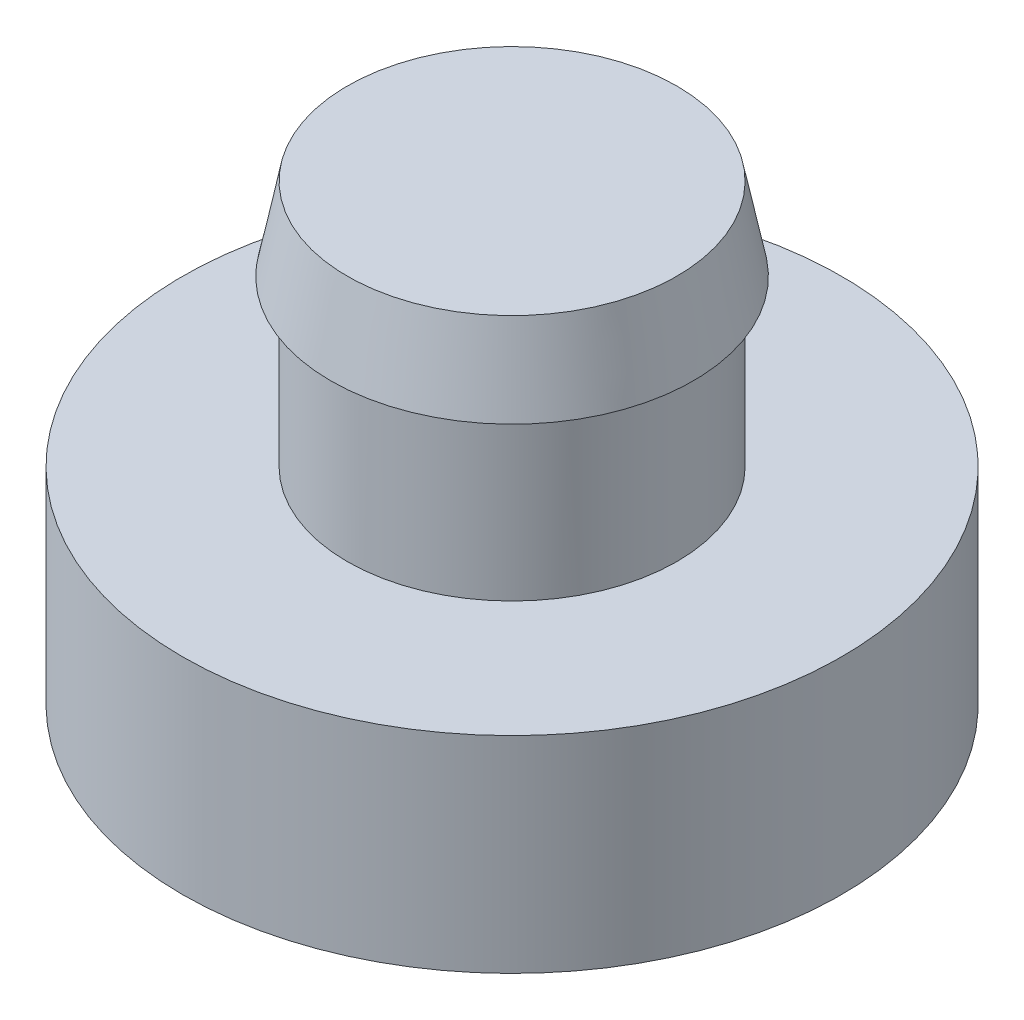
ISO-10303-21;
HEADER;
FILE_DESCRIPTION(('STEP AP214'),'2;1');
FILE_NAME('part.step','',(''),(''),'','','');
FILE_SCHEMA(('AUTOMOTIVE_DESIGN { 1 0 10303 214 1 1 1 1 }'));
ENDSEC;
DATA;
#1=APPLICATION_CONTEXT('core data for automotive mechanical design processes');
#2=APPLICATION_PROTOCOL_DEFINITION('international standard','automotive_design',2000,#1);
#3=PRODUCT_CONTEXT('',#1,'mechanical');
#4=PRODUCT('Part','Part','',(#3));
#5=PRODUCT_RELATED_PRODUCT_CATEGORY('part','',(#4));
#6=PRODUCT_DEFINITION_FORMATION('','',#4);
#7=PRODUCT_DEFINITION_CONTEXT('part definition',#1,'design');
#8=PRODUCT_DEFINITION('design','',#6,#7);
#9=PRODUCT_DEFINITION_SHAPE('','',#8);
#10=(LENGTH_UNIT() NAMED_UNIT(*) SI_UNIT(.MILLI.,.METRE.));
#11=(NAMED_UNIT(*) PLANE_ANGLE_UNIT() SI_UNIT($,.RADIAN.));
#12=(NAMED_UNIT(*) SI_UNIT($,.STERADIAN.) SOLID_ANGLE_UNIT());
#13=UNCERTAINTY_MEASURE_WITH_UNIT(LENGTH_MEASURE(1.E-05),#10,'distance_accuracy_value','');
#14=(GEOMETRIC_REPRESENTATION_CONTEXT(3) GLOBAL_UNCERTAINTY_ASSIGNED_CONTEXT((#13)) GLOBAL_UNIT_ASSIGNED_CONTEXT((#10,
#11,#12)) REPRESENTATION_CONTEXT('',''));
#15=CARTESIAN_POINT('',(0.,0.,0.));
#16=DIRECTION('',(0.,0.,1.));
#17=DIRECTION('',(1.,0.,0.));
#18=AXIS2_PLACEMENT_3D('',#15,#16,#17);
#19=CARTESIAN_POINT('',(0.,2.5,0.));
#20=DIRECTION('',(0.,-1.,0.));
#21=DIRECTION('',(0.,0.,-1.));
#22=AXIS2_PLACEMENT_3D('',#19,#20,#21);
#23=CYLINDRICAL_SURFACE('',#22,4.);
#24=CARTESIAN_POINT('',(0.,2.5,0.));
#25=DIRECTION('',(0.,1.,0.));
#26=DIRECTION('',(0.,0.,1.));
#27=AXIS2_PLACEMENT_3D('',#24,#25,#26);
#28=CIRCLE('',#27,4.);
#29=CARTESIAN_POINT('',(0.,2.5,4.));
#30=VERTEX_POINT('',#29);
#31=EDGE_CURVE('E38',#30,#30,#28,.T.);
#32=ORIENTED_EDGE('',*,*,#31,.F.);
#33=EDGE_LOOP('',(#32));
#34=FACE_BOUND('',#33,.T.);
#35=CARTESIAN_POINT('',(0.,0.,0.));
#36=DIRECTION('',(0.,1.,0.));
#37=DIRECTION('',(0.,0.,1.));
#38=AXIS2_PLACEMENT_3D('',#35,#36,#37);
#39=CIRCLE('',#38,4.);
#40=CARTESIAN_POINT('',(0.,0.,4.));
#41=VERTEX_POINT('',#40);
#42=EDGE_CURVE('E34',#41,#41,#39,.T.);
#43=ORIENTED_EDGE('',*,*,#42,.T.);
#44=EDGE_LOOP('',(#43));
#45=FACE_BOUND('',#44,.T.);
#46=ADVANCED_FACE('F31',(#34,#45),#23,.T.);
#47=CARTESIAN_POINT('',(0.,2.5,0.));
#48=DIRECTION('',(0.,1.,0.));
#49=DIRECTION('',(0.,0.,1.));
#50=AXIS2_PLACEMENT_3D('',#47,#48,#49);
#51=PLANE('',#50);
#52=CARTESIAN_POINT('',(0.,2.5,0.));
#53=DIRECTION('',(0.,1.,0.));
#54=DIRECTION('',(0.,0.,1.));
#55=AXIS2_PLACEMENT_3D('',#52,#53,#54);
#56=CIRCLE('',#55,2.);
#57=CARTESIAN_POINT('',(0.,2.5,2.));
#58=VERTEX_POINT('',#57);
#59=EDGE_CURVE('E10',#58,#58,#56,.T.);
#60=ORIENTED_EDGE('',*,*,#59,.F.);
#61=EDGE_LOOP('',(#60));
#62=FACE_BOUND('',#61,.T.);
#63=ORIENTED_EDGE('',*,*,#31,.T.);
#64=EDGE_LOOP('',(#63));
#65=FACE_BOUND('',#64,.T.);
#66=ADVANCED_FACE('F69',(#62,#65),#51,.T.);
#67=CARTESIAN_POINT('',(0.,0.,0.));
#68=DIRECTION('',(0.,1.,0.));
#69=DIRECTION('',(0.,0.,1.));
#70=AXIS2_PLACEMENT_3D('',#67,#68,#69);
#71=PLANE('',#70);
#72=ORIENTED_EDGE('',*,*,#42,.F.);
#73=EDGE_LOOP('',(#72));
#74=FACE_BOUND('',#73,.T.);
#75=ADVANCED_FACE('F74',(#74),#71,.F.);
#76=CARTESIAN_POINT('',(0.,5.5,0.));
#77=DIRECTION('',(0.,-1.,0.));
#78=DIRECTION('',(0.,0.,-1.));
#79=AXIS2_PLACEMENT_3D('',#76,#77,#78);
#80=CYLINDRICAL_SURFACE('',#79,2.);
#81=CARTESIAN_POINT('',(0.,4.5,0.));
#82=DIRECTION('',(0.,-1.,0.));
#83=DIRECTION('',(0.,0.,-1.));
#84=AXIS2_PLACEMENT_3D('',#81,#82,#83);
#85=CIRCLE('',#84,2.);
#86=CARTESIAN_POINT('',(0.,4.5,-2.));
#87=VERTEX_POINT('',#86);
#88=EDGE_CURVE('E47',#87,#87,#85,.T.);
#89=ORIENTED_EDGE('',*,*,#88,.T.);
#90=EDGE_LOOP('',(#89));
#91=FACE_BOUND('',#90,.T.);
#92=ORIENTED_EDGE('',*,*,#59,.T.);
#93=EDGE_LOOP('',(#92));
#94=FACE_BOUND('',#93,.T.);
#95=ADVANCED_FACE('F83',(#91,#94),#80,.T.);
#96=CARTESIAN_POINT('',(0.,4.5,0.));
#97=DIRECTION('',(0.,-1.,0.));
#98=DIRECTION('',(0.,0.,-1.));
#99=AXIS2_PLACEMENT_3D('',#96,#97,#98);
#100=CONICAL_SURFACE('',#99,2.2,0.19739555984988);
#101=CARTESIAN_POINT('',(0.,5.5,0.));
#102=DIRECTION('',(0.,-1.,0.));
#103=DIRECTION('',(0.,0.,-1.));
#104=AXIS2_PLACEMENT_3D('',#101,#102,#103);
#105=CIRCLE('',#104,2.);
#106=CARTESIAN_POINT('',(0.,5.5,-2.));
#107=VERTEX_POINT('',#106);
#108=EDGE_CURVE('E50',#107,#107,#105,.T.);
#109=ORIENTED_EDGE('',*,*,#108,.T.);
#110=EDGE_LOOP('',(#109));
#111=FACE_BOUND('',#110,.T.);
#112=CARTESIAN_POINT('',(0.,4.5,0.));
#113=DIRECTION('',(0.,-1.,0.));
#114=DIRECTION('',(0.,0.,-1.));
#115=AXIS2_PLACEMENT_3D('',#112,#113,#114);
#116=CIRCLE('',#115,2.2);
#117=CARTESIAN_POINT('',(0.,4.5,-2.2));
#118=VERTEX_POINT('',#117);
#119=EDGE_CURVE('E44',#118,#118,#116,.T.);
#120=ORIENTED_EDGE('',*,*,#119,.F.);
#121=EDGE_LOOP('',(#120));
#122=FACE_BOUND('',#121,.T.);
#123=ADVANCED_FACE('F54',(#111,#122),#100,.T.);
#124=CARTESIAN_POINT('',(2.,4.5,0.));
#125=DIRECTION('',(0.,-1.,0.));
#126=DIRECTION('',(0.,0.,-1.));
#127=AXIS2_PLACEMENT_3D('',#124,#125,#126);
#128=PLANE('',#127);
#129=ORIENTED_EDGE('',*,*,#119,.T.);
#130=EDGE_LOOP('',(#129));
#131=FACE_BOUND('',#130,.T.);
#132=ORIENTED_EDGE('',*,*,#88,.F.);
#133=EDGE_LOOP('',(#132));
#134=FACE_BOUND('',#133,.T.);
#135=ADVANCED_FACE('F59',(#131,#134),#128,.T.);
#136=CARTESIAN_POINT('',(0.,5.5,0.));
#137=DIRECTION('',(0.,1.,0.));
#138=DIRECTION('',(0.,0.,1.));
#139=AXIS2_PLACEMENT_3D('',#136,#137,#138);
#140=PLANE('',#139);
#141=ORIENTED_EDGE('',*,*,#108,.F.);
#142=EDGE_LOOP('',(#141));
#143=FACE_BOUND('',#142,.T.);
#144=ADVANCED_FACE('F57',(#143),#140,.T.);
#145=CLOSED_SHELL('',(#46,#66,#75,#95,#123,#135,#144));
#146=MANIFOLD_SOLID_BREP('B2',#145);
#147=ADVANCED_BREP_SHAPE_REPRESENTATION('',(#18,#146),#14);
#148=SHAPE_DEFINITION_REPRESENTATION(#9,#147);
ENDSEC;
END-ISO-10303-21;
